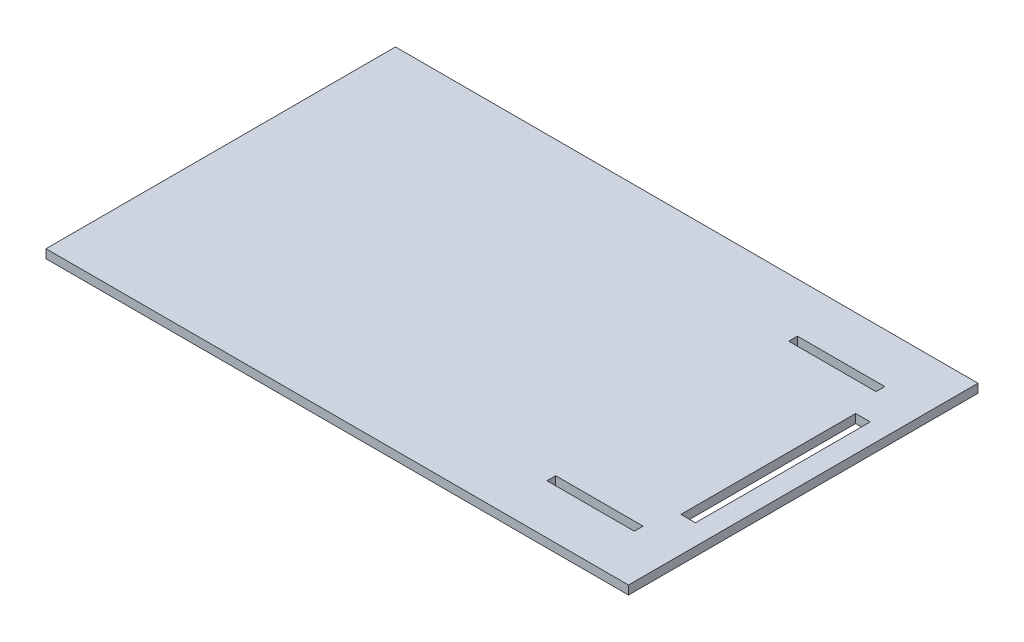
ISO-10303-21;
HEADER;
FILE_DESCRIPTION(('STEP AP214'),'2;1');
FILE_NAME('part.step','',(''),(''),'','','');
FILE_SCHEMA(('AUTOMOTIVE_DESIGN { 1 0 10303 214 1 1 1 1 }'));
ENDSEC;
DATA;
#1=APPLICATION_CONTEXT('core data for automotive mechanical design processes');
#2=APPLICATION_PROTOCOL_DEFINITION('international standard','automotive_design',2000,#1);
#3=PRODUCT_CONTEXT('',#1,'mechanical');
#4=PRODUCT('Part','Part','',(#3));
#5=PRODUCT_RELATED_PRODUCT_CATEGORY('part','',(#4));
#6=PRODUCT_DEFINITION_FORMATION('','',#4);
#7=PRODUCT_DEFINITION_CONTEXT('part definition',#1,'design');
#8=PRODUCT_DEFINITION('design','',#6,#7);
#9=PRODUCT_DEFINITION_SHAPE('','',#8);
#10=(LENGTH_UNIT() NAMED_UNIT(*) SI_UNIT(.MILLI.,.METRE.));
#11=(NAMED_UNIT(*) PLANE_ANGLE_UNIT() SI_UNIT($,.RADIAN.));
#12=(NAMED_UNIT(*) SI_UNIT($,.STERADIAN.) SOLID_ANGLE_UNIT());
#13=UNCERTAINTY_MEASURE_WITH_UNIT(LENGTH_MEASURE(1.E-05),#10,'distance_accuracy_value','');
#14=(GEOMETRIC_REPRESENTATION_CONTEXT(3) GLOBAL_UNCERTAINTY_ASSIGNED_CONTEXT((#13)) GLOBAL_UNIT_ASSIGNED_CONTEXT((#10,
#11,#12)) REPRESENTATION_CONTEXT('',''));
#15=CARTESIAN_POINT('',(0.,0.,0.));
#16=DIRECTION('',(0.,0.,1.));
#17=DIRECTION('',(1.,0.,0.));
#18=AXIS2_PLACEMENT_3D('',#15,#16,#17);
#19=CARTESIAN_POINT('',(-100.,3.,60.));
#20=DIRECTION('',(1.,0.,0.));
#21=DIRECTION('',(0.,0.,-1.));
#22=AXIS2_PLACEMENT_3D('',#19,#20,#21);
#23=PLANE('',#22);
#24=DIRECTION('',(0.,0.,1.));
#25=VECTOR('',#24,1.);
#26=CARTESIAN_POINT('',(-100.,0.,60.));
#27=LINE('',#26,#25);
#28=CARTESIAN_POINT('',(-100.,0.,-60.));
#29=VERTEX_POINT('',#28);
#30=CARTESIAN_POINT('',(-100.,0.,60.));
#31=VERTEX_POINT('',#30);
#32=EDGE_CURVE('E238',#29,#31,#27,.T.);
#33=ORIENTED_EDGE('',*,*,#32,.T.);
#34=DIRECTION('',(0.,-1.,0.));
#35=VECTOR('',#34,1.);
#36=CARTESIAN_POINT('',(-100.,3.,60.));
#37=LINE('',#36,#35);
#38=CARTESIAN_POINT('',(-100.,3.,60.));
#39=VERTEX_POINT('',#38);
#40=EDGE_CURVE('E11',#39,#31,#37,.T.);
#41=ORIENTED_EDGE('',*,*,#40,.F.);
#42=DIRECTION('',(0.,0.,1.));
#43=VECTOR('',#42,1.);
#44=CARTESIAN_POINT('',(-100.,3.,60.));
#45=LINE('',#44,#43);
#46=CARTESIAN_POINT('',(-100.,3.,-60.));
#47=VERTEX_POINT('',#46);
#48=EDGE_CURVE('E245',#47,#39,#45,.T.);
#49=ORIENTED_EDGE('',*,*,#48,.F.);
#50=DIRECTION('',(0.,-1.,0.));
#51=VECTOR('',#50,1.);
#52=CARTESIAN_POINT('',(-100.,3.,-60.));
#53=LINE('',#52,#51);
#54=EDGE_CURVE('E255',#47,#29,#53,.T.);
#55=ORIENTED_EDGE('',*,*,#54,.T.);
#56=EDGE_LOOP('',(#33,#41,#49,#55));
#57=FACE_BOUND('',#56,.T.);
#58=ADVANCED_FACE('F32',(#57),#23,.F.);
#59=CARTESIAN_POINT('',(100.,3.,60.));
#60=DIRECTION('',(0.,0.,-1.));
#61=DIRECTION('',(-1.,0.,0.));
#62=AXIS2_PLACEMENT_3D('',#59,#60,#61);
#63=PLANE('',#62);
#64=DIRECTION('',(1.,0.,0.));
#65=VECTOR('',#64,1.);
#66=CARTESIAN_POINT('',(100.,0.,60.));
#67=LINE('',#66,#65);
#68=CARTESIAN_POINT('',(100.,0.,60.));
#69=VERTEX_POINT('',#68);
#70=EDGE_CURVE('E258',#31,#69,#67,.T.);
#71=ORIENTED_EDGE('',*,*,#70,.T.);
#72=DIRECTION('',(0.,-1.,0.));
#73=VECTOR('',#72,1.);
#74=CARTESIAN_POINT('',(100.,3.,60.));
#75=LINE('',#74,#73);
#76=CARTESIAN_POINT('',(100.,3.,60.));
#77=VERTEX_POINT('',#76);
#78=EDGE_CURVE('E39',#77,#69,#75,.T.);
#79=ORIENTED_EDGE('',*,*,#78,.F.);
#80=DIRECTION('',(1.,0.,0.));
#81=VECTOR('',#80,1.);
#82=CARTESIAN_POINT('',(100.,3.,60.));
#83=LINE('',#82,#81);
#84=EDGE_CURVE('E248',#39,#77,#83,.T.);
#85=ORIENTED_EDGE('',*,*,#84,.F.);
#86=ORIENTED_EDGE('',*,*,#40,.T.);
#87=EDGE_LOOP('',(#71,#79,#85,#86));
#88=FACE_BOUND('',#87,.T.);
#89=ADVANCED_FACE('F287',(#88),#63,.F.);
#90=CARTESIAN_POINT('',(100.,3.,60.));
#91=DIRECTION('',(-1.,0.,0.));
#92=DIRECTION('',(0.,0.,1.));
#93=AXIS2_PLACEMENT_3D('',#90,#91,#92);
#94=PLANE('',#93);
#95=DIRECTION('',(0.,0.,-1.));
#96=VECTOR('',#95,1.);
#97=CARTESIAN_POINT('',(100.,0.,60.));
#98=LINE('',#97,#96);
#99=CARTESIAN_POINT('',(100.,0.,-60.));
#100=VERTEX_POINT('',#99);
#101=EDGE_CURVE('E260',#69,#100,#98,.T.);
#102=ORIENTED_EDGE('',*,*,#101,.T.);
#103=DIRECTION('',(0.,-1.,0.));
#104=VECTOR('',#103,1.);
#105=CARTESIAN_POINT('',(100.,3.,-60.));
#106=LINE('',#105,#104);
#107=CARTESIAN_POINT('',(100.,3.,-60.));
#108=VERTEX_POINT('',#107);
#109=EDGE_CURVE('E265',#108,#100,#106,.T.);
#110=ORIENTED_EDGE('',*,*,#109,.F.);
#111=DIRECTION('',(0.,0.,-1.));
#112=VECTOR('',#111,1.);
#113=CARTESIAN_POINT('',(100.,3.,60.));
#114=LINE('',#113,#112);
#115=EDGE_CURVE('E251',#77,#108,#114,.T.);
#116=ORIENTED_EDGE('',*,*,#115,.F.);
#117=ORIENTED_EDGE('',*,*,#78,.T.);
#118=EDGE_LOOP('',(#102,#110,#116,#117));
#119=FACE_BOUND('',#118,.T.);
#120=ADVANCED_FACE('F272',(#119),#94,.F.);
#121=CARTESIAN_POINT('',(100.,3.,-60.));
#122=DIRECTION('',(0.,0.,1.));
#123=DIRECTION('',(1.,0.,0.));
#124=AXIS2_PLACEMENT_3D('',#121,#122,#123);
#125=PLANE('',#124);
#126=DIRECTION('',(-1.,0.,0.));
#127=VECTOR('',#126,1.);
#128=CARTESIAN_POINT('',(100.,0.,-60.));
#129=LINE('',#128,#127);
#130=EDGE_CURVE('E249',#100,#29,#129,.T.);
#131=ORIENTED_EDGE('',*,*,#130,.T.);
#132=ORIENTED_EDGE('',*,*,#54,.F.);
#133=DIRECTION('',(-1.,0.,0.));
#134=VECTOR('',#133,1.);
#135=CARTESIAN_POINT('',(100.,3.,-60.));
#136=LINE('',#135,#134);
#137=EDGE_CURVE('E253',#108,#47,#136,.T.);
#138=ORIENTED_EDGE('',*,*,#137,.F.);
#139=ORIENTED_EDGE('',*,*,#109,.T.);
#140=EDGE_LOOP('',(#131,#132,#138,#139));
#141=FACE_BOUND('',#140,.T.);
#142=ADVANCED_FACE('F280',(#141),#125,.F.);
#143=CARTESIAN_POINT('',(0.,3.,0.));
#144=DIRECTION('',(0.,1.,0.));
#145=DIRECTION('',(0.,0.,1.));
#146=AXIS2_PLACEMENT_3D('',#143,#144,#145);
#147=PLANE('',#146);
#148=DIRECTION('',(1.,0.,0.));
#149=VECTOR('',#148,1.);
#150=CARTESIAN_POINT('',(55.,3.,43.));
#151=LINE('',#150,#149);
#152=CARTESIAN_POINT('',(55.,3.,43.));
#153=VERTEX_POINT('',#152);
#154=CARTESIAN_POINT('',(85.,3.,43.));
#155=VERTEX_POINT('',#154);
#156=EDGE_CURVE('E46',#153,#155,#151,.T.);
#157=ORIENTED_EDGE('',*,*,#156,.F.);
#158=DIRECTION('',(0.,0.,1.));
#159=VECTOR('',#158,1.);
#160=CARTESIAN_POINT('',(55.,3.,43.));
#161=LINE('',#160,#159);
#162=CARTESIAN_POINT('',(55.,3.,40.));
#163=VERTEX_POINT('',#162);
#164=EDGE_CURVE('E162',#163,#153,#161,.T.);
#165=ORIENTED_EDGE('',*,*,#164,.F.);
#166=DIRECTION('',(-1.,0.,0.));
#167=VECTOR('',#166,1.);
#168=CARTESIAN_POINT('',(55.,3.,40.));
#169=LINE('',#168,#167);
#170=CARTESIAN_POINT('',(85.,3.,40.));
#171=VERTEX_POINT('',#170);
#172=EDGE_CURVE('E165',#171,#163,#169,.T.);
#173=ORIENTED_EDGE('',*,*,#172,.F.);
#174=DIRECTION('',(0.,0.,-1.));
#175=VECTOR('',#174,1.);
#176=CARTESIAN_POINT('',(85.,3.,43.));
#177=LINE('',#176,#175);
#178=EDGE_CURVE('E171',#155,#171,#177,.T.);
#179=ORIENTED_EDGE('',*,*,#178,.F.);
#180=EDGE_LOOP('',(#157,#165,#173,#179));
#181=FACE_BOUND('',#180,.T.);
#182=DIRECTION('',(0.,0.,-1.));
#183=VECTOR('',#182,1.);
#184=CARTESIAN_POINT('',(85.,3.,-43.));
#185=LINE('',#184,#183);
#186=CARTESIAN_POINT('',(85.,3.,-40.));
#187=VERTEX_POINT('',#186);
#188=CARTESIAN_POINT('',(85.,3.,-43.));
#189=VERTEX_POINT('',#188);
#190=EDGE_CURVE('E177',#187,#189,#185,.T.);
#191=ORIENTED_EDGE('',*,*,#190,.F.);
#192=DIRECTION('',(1.,0.,0.));
#193=VECTOR('',#192,1.);
#194=CARTESIAN_POINT('',(55.,3.,-40.));
#195=LINE('',#194,#193);
#196=CARTESIAN_POINT('',(55.,3.,-40.));
#197=VERTEX_POINT('',#196);
#198=EDGE_CURVE('E185',#197,#187,#195,.T.);
#199=ORIENTED_EDGE('',*,*,#198,.F.);
#200=DIRECTION('',(0.,0.,1.));
#201=VECTOR('',#200,1.);
#202=CARTESIAN_POINT('',(55.,3.,-43.));
#203=LINE('',#202,#201);
#204=CARTESIAN_POINT('',(55.,3.,-43.));
#205=VERTEX_POINT('',#204);
#206=EDGE_CURVE('E199',#205,#197,#203,.T.);
#207=ORIENTED_EDGE('',*,*,#206,.F.);
#208=DIRECTION('',(-1.,0.,0.));
#209=VECTOR('',#208,1.);
#210=CARTESIAN_POINT('',(55.,3.,-43.));
#211=LINE('',#210,#209);
#212=EDGE_CURVE('E196',#189,#205,#211,.T.);
#213=ORIENTED_EDGE('',*,*,#212,.F.);
#214=EDGE_LOOP('',(#191,#199,#207,#213));
#215=FACE_BOUND('',#214,.T.);
#216=DIRECTION('',(0.,0.,-1.));
#217=VECTOR('',#216,1.);
#218=CARTESIAN_POINT('',(93.,3.,-30.));
#219=LINE('',#218,#217);
#220=CARTESIAN_POINT('',(93.,3.,30.));
#221=VERTEX_POINT('',#220);
#222=CARTESIAN_POINT('',(93.,3.,-30.));
#223=VERTEX_POINT('',#222);
#224=EDGE_CURVE('E206',#221,#223,#219,.T.);
#225=ORIENTED_EDGE('',*,*,#224,.F.);
#226=DIRECTION('',(1.,0.,0.));
#227=VECTOR('',#226,1.);
#228=CARTESIAN_POINT('',(88.,3.,30.));
#229=LINE('',#228,#227);
#230=CARTESIAN_POINT('',(88.,3.,30.));
#231=VERTEX_POINT('',#230);
#232=EDGE_CURVE('E217',#231,#221,#229,.T.);
#233=ORIENTED_EDGE('',*,*,#232,.F.);
#234=DIRECTION('',(0.,0.,1.));
#235=VECTOR('',#234,1.);
#236=CARTESIAN_POINT('',(88.,3.,-30.));
#237=LINE('',#236,#235);
#238=CARTESIAN_POINT('',(88.,3.,-30.));
#239=VERTEX_POINT('',#238);
#240=EDGE_CURVE('E231',#239,#231,#237,.T.);
#241=ORIENTED_EDGE('',*,*,#240,.F.);
#242=DIRECTION('',(-1.,0.,0.));
#243=VECTOR('',#242,1.);
#244=CARTESIAN_POINT('',(88.,3.,-30.));
#245=LINE('',#244,#243);
#246=EDGE_CURVE('E228',#223,#239,#245,.T.);
#247=ORIENTED_EDGE('',*,*,#246,.F.);
#248=EDGE_LOOP('',(#225,#233,#241,#247));
#249=FACE_BOUND('',#248,.T.);
#250=ORIENTED_EDGE('',*,*,#48,.T.);
#251=ORIENTED_EDGE('',*,*,#84,.T.);
#252=ORIENTED_EDGE('',*,*,#115,.T.);
#253=ORIENTED_EDGE('',*,*,#137,.T.);
#254=EDGE_LOOP('',(#250,#251,#252,#253));
#255=FACE_BOUND('',#254,.T.);
#256=ADVANCED_FACE('F286',(#181,#215,#249,#255),#147,.T.);
#257=CARTESIAN_POINT('',(0.,0.,0.));
#258=DIRECTION('',(0.,1.,0.));
#259=DIRECTION('',(0.,0.,1.));
#260=AXIS2_PLACEMENT_3D('',#257,#258,#259);
#261=PLANE('',#260);
#262=DIRECTION('',(0.,0.,1.));
#263=VECTOR('',#262,1.);
#264=CARTESIAN_POINT('',(55.,0.,43.));
#265=LINE('',#264,#263);
#266=CARTESIAN_POINT('',(55.,0.,40.));
#267=VERTEX_POINT('',#266);
#268=CARTESIAN_POINT('',(55.,0.,43.));
#269=VERTEX_POINT('',#268);
#270=EDGE_CURVE('E152',#267,#269,#265,.T.);
#271=ORIENTED_EDGE('',*,*,#270,.T.);
#272=DIRECTION('',(1.,0.,0.));
#273=VECTOR('',#272,1.);
#274=CARTESIAN_POINT('',(55.,0.,43.));
#275=LINE('',#274,#273);
#276=CARTESIAN_POINT('',(85.,0.,43.));
#277=VERTEX_POINT('',#276);
#278=EDGE_CURVE('E146',#269,#277,#275,.T.);
#279=ORIENTED_EDGE('',*,*,#278,.T.);
#280=DIRECTION('',(0.,0.,-1.));
#281=VECTOR('',#280,1.);
#282=CARTESIAN_POINT('',(85.,0.,43.));
#283=LINE('',#282,#281);
#284=CARTESIAN_POINT('',(85.,0.,40.));
#285=VERTEX_POINT('',#284);
#286=EDGE_CURVE('E155',#277,#285,#283,.T.);
#287=ORIENTED_EDGE('',*,*,#286,.T.);
#288=DIRECTION('',(-1.,0.,0.));
#289=VECTOR('',#288,1.);
#290=CARTESIAN_POINT('',(55.,0.,40.));
#291=LINE('',#290,#289);
#292=EDGE_CURVE('E54',#285,#267,#291,.T.);
#293=ORIENTED_EDGE('',*,*,#292,.T.);
#294=EDGE_LOOP('',(#271,#279,#287,#293));
#295=FACE_BOUND('',#294,.T.);
#296=DIRECTION('',(1.,0.,0.));
#297=VECTOR('',#296,1.);
#298=CARTESIAN_POINT('',(55.,0.,-40.));
#299=LINE('',#298,#297);
#300=CARTESIAN_POINT('',(55.,0.,-40.));
#301=VERTEX_POINT('',#300);
#302=CARTESIAN_POINT('',(85.,0.,-40.));
#303=VERTEX_POINT('',#302);
#304=EDGE_CURVE('E191',#301,#303,#299,.T.);
#305=ORIENTED_EDGE('',*,*,#304,.T.);
#306=DIRECTION('',(0.,0.,-1.));
#307=VECTOR('',#306,1.);
#308=CARTESIAN_POINT('',(85.,0.,-43.));
#309=LINE('',#308,#307);
#310=CARTESIAN_POINT('',(85.,0.,-43.));
#311=VERTEX_POINT('',#310);
#312=EDGE_CURVE('E181',#303,#311,#309,.T.);
#313=ORIENTED_EDGE('',*,*,#312,.T.);
#314=DIRECTION('',(-1.,0.,0.));
#315=VECTOR('',#314,1.);
#316=CARTESIAN_POINT('',(55.,0.,-43.));
#317=LINE('',#316,#315);
#318=CARTESIAN_POINT('',(55.,0.,-43.));
#319=VERTEX_POINT('',#318);
#320=EDGE_CURVE('E184',#311,#319,#317,.T.);
#321=ORIENTED_EDGE('',*,*,#320,.T.);
#322=DIRECTION('',(0.,0.,1.));
#323=VECTOR('',#322,1.);
#324=CARTESIAN_POINT('',(55.,0.,-43.));
#325=LINE('',#324,#323);
#326=EDGE_CURVE('E188',#319,#301,#325,.T.);
#327=ORIENTED_EDGE('',*,*,#326,.T.);
#328=EDGE_LOOP('',(#305,#313,#321,#327));
#329=FACE_BOUND('',#328,.T.);
#330=DIRECTION('',(1.,0.,0.));
#331=VECTOR('',#330,1.);
#332=CARTESIAN_POINT('',(88.,0.,30.));
#333=LINE('',#332,#331);
#334=CARTESIAN_POINT('',(88.,0.,30.));
#335=VERTEX_POINT('',#334);
#336=CARTESIAN_POINT('',(93.,0.,30.));
#337=VERTEX_POINT('',#336);
#338=EDGE_CURVE('E223',#335,#337,#333,.T.);
#339=ORIENTED_EDGE('',*,*,#338,.T.);
#340=DIRECTION('',(0.,0.,-1.));
#341=VECTOR('',#340,1.);
#342=CARTESIAN_POINT('',(93.,0.,-30.));
#343=LINE('',#342,#341);
#344=CARTESIAN_POINT('',(93.,0.,-30.));
#345=VERTEX_POINT('',#344);
#346=EDGE_CURVE('E213',#337,#345,#343,.T.);
#347=ORIENTED_EDGE('',*,*,#346,.T.);
#348=DIRECTION('',(-1.,0.,0.));
#349=VECTOR('',#348,1.);
#350=CARTESIAN_POINT('',(88.,0.,-30.));
#351=LINE('',#350,#349);
#352=CARTESIAN_POINT('',(88.,0.,-30.));
#353=VERTEX_POINT('',#352);
#354=EDGE_CURVE('E216',#345,#353,#351,.T.);
#355=ORIENTED_EDGE('',*,*,#354,.T.);
#356=DIRECTION('',(0.,0.,1.));
#357=VECTOR('',#356,1.);
#358=CARTESIAN_POINT('',(88.,0.,-30.));
#359=LINE('',#358,#357);
#360=EDGE_CURVE('E220',#353,#335,#359,.T.);
#361=ORIENTED_EDGE('',*,*,#360,.T.);
#362=EDGE_LOOP('',(#339,#347,#355,#361));
#363=FACE_BOUND('',#362,.T.);
#364=ORIENTED_EDGE('',*,*,#32,.F.);
#365=ORIENTED_EDGE('',*,*,#130,.F.);
#366=ORIENTED_EDGE('',*,*,#101,.F.);
#367=ORIENTED_EDGE('',*,*,#70,.F.);
#368=EDGE_LOOP('',(#364,#365,#366,#367));
#369=FACE_BOUND('',#368,.T.);
#370=ADVANCED_FACE('F159',(#295,#329,#363,#369),#261,.F.);
#371=CARTESIAN_POINT('',(93.,0.,-30.));
#372=DIRECTION('',(1.,0.,0.));
#373=DIRECTION('',(0.,0.,-1.));
#374=AXIS2_PLACEMENT_3D('',#371,#372,#373);
#375=PLANE('',#374);
#376=ORIENTED_EDGE('',*,*,#224,.T.);
#377=DIRECTION('',(0.,1.,0.));
#378=VECTOR('',#377,1.);
#379=CARTESIAN_POINT('',(93.,0.,-30.));
#380=LINE('',#379,#378);
#381=EDGE_CURVE('E226',#345,#223,#380,.T.);
#382=ORIENTED_EDGE('',*,*,#381,.F.);
#383=ORIENTED_EDGE('',*,*,#346,.F.);
#384=DIRECTION('',(0.,1.,0.));
#385=VECTOR('',#384,1.);
#386=CARTESIAN_POINT('',(93.,0.,30.));
#387=LINE('',#386,#385);
#388=EDGE_CURVE('E236',#337,#221,#387,.T.);
#389=ORIENTED_EDGE('',*,*,#388,.T.);
#390=EDGE_LOOP('',(#376,#382,#383,#389));
#391=FACE_BOUND('',#390,.T.);
#392=ADVANCED_FACE('F299',(#391),#375,.F.);
#393=CARTESIAN_POINT('',(88.,0.,30.));
#394=DIRECTION('',(0.,0.,1.));
#395=DIRECTION('',(1.,0.,0.));
#396=AXIS2_PLACEMENT_3D('',#393,#394,#395);
#397=PLANE('',#396);
#398=ORIENTED_EDGE('',*,*,#232,.T.);
#399=ORIENTED_EDGE('',*,*,#388,.F.);
#400=ORIENTED_EDGE('',*,*,#338,.F.);
#401=DIRECTION('',(0.,1.,0.));
#402=VECTOR('',#401,1.);
#403=CARTESIAN_POINT('',(88.,0.,30.));
#404=LINE('',#403,#402);
#405=EDGE_CURVE('E239',#335,#231,#404,.T.);
#406=ORIENTED_EDGE('',*,*,#405,.T.);
#407=EDGE_LOOP('',(#398,#399,#400,#406));
#408=FACE_BOUND('',#407,.T.);
#409=ADVANCED_FACE('F305',(#408),#397,.F.);
#410=CARTESIAN_POINT('',(88.,0.,-30.));
#411=DIRECTION('',(-1.,0.,0.));
#412=DIRECTION('',(0.,0.,1.));
#413=AXIS2_PLACEMENT_3D('',#410,#411,#412);
#414=PLANE('',#413);
#415=ORIENTED_EDGE('',*,*,#240,.T.);
#416=ORIENTED_EDGE('',*,*,#405,.F.);
#417=ORIENTED_EDGE('',*,*,#360,.F.);
#418=DIRECTION('',(0.,1.,0.));
#419=VECTOR('',#418,1.);
#420=CARTESIAN_POINT('',(88.,0.,-30.));
#421=LINE('',#420,#419);
#422=EDGE_CURVE('E241',#353,#239,#421,.T.);
#423=ORIENTED_EDGE('',*,*,#422,.T.);
#424=EDGE_LOOP('',(#415,#416,#417,#423));
#425=FACE_BOUND('',#424,.T.);
#426=ADVANCED_FACE('F311',(#425),#414,.F.);
#427=CARTESIAN_POINT('',(88.,0.,-30.));
#428=DIRECTION('',(0.,0.,-1.));
#429=DIRECTION('',(-1.,0.,0.));
#430=AXIS2_PLACEMENT_3D('',#427,#428,#429);
#431=PLANE('',#430);
#432=ORIENTED_EDGE('',*,*,#246,.T.);
#433=ORIENTED_EDGE('',*,*,#422,.F.);
#434=ORIENTED_EDGE('',*,*,#354,.F.);
#435=ORIENTED_EDGE('',*,*,#381,.T.);
#436=EDGE_LOOP('',(#432,#433,#434,#435));
#437=FACE_BOUND('',#436,.T.);
#438=ADVANCED_FACE('F307',(#437),#431,.F.);
#439=CARTESIAN_POINT('',(85.,0.,-43.));
#440=DIRECTION('',(1.,0.,0.));
#441=DIRECTION('',(0.,0.,-1.));
#442=AXIS2_PLACEMENT_3D('',#439,#440,#441);
#443=PLANE('',#442);
#444=ORIENTED_EDGE('',*,*,#190,.T.);
#445=DIRECTION('',(0.,1.,0.));
#446=VECTOR('',#445,1.);
#447=CARTESIAN_POINT('',(85.,0.,-43.));
#448=LINE('',#447,#446);
#449=EDGE_CURVE('E194',#311,#189,#448,.T.);
#450=ORIENTED_EDGE('',*,*,#449,.F.);
#451=ORIENTED_EDGE('',*,*,#312,.F.);
#452=DIRECTION('',(0.,1.,0.));
#453=VECTOR('',#452,1.);
#454=CARTESIAN_POINT('',(85.,0.,-40.));
#455=LINE('',#454,#453);
#456=EDGE_CURVE('E204',#303,#187,#455,.T.);
#457=ORIENTED_EDGE('',*,*,#456,.T.);
#458=EDGE_LOOP('',(#444,#450,#451,#457));
#459=FACE_BOUND('',#458,.T.);
#460=ADVANCED_FACE('F310',(#459),#443,.F.);
#461=CARTESIAN_POINT('',(55.,0.,-40.));
#462=DIRECTION('',(0.,0.,1.));
#463=DIRECTION('',(1.,0.,0.));
#464=AXIS2_PLACEMENT_3D('',#461,#462,#463);
#465=PLANE('',#464);
#466=ORIENTED_EDGE('',*,*,#198,.T.);
#467=ORIENTED_EDGE('',*,*,#456,.F.);
#468=ORIENTED_EDGE('',*,*,#304,.F.);
#469=DIRECTION('',(0.,1.,0.));
#470=VECTOR('',#469,1.);
#471=CARTESIAN_POINT('',(55.,0.,-40.));
#472=LINE('',#471,#470);
#473=EDGE_CURVE('E207',#301,#197,#472,.T.);
#474=ORIENTED_EDGE('',*,*,#473,.T.);
#475=EDGE_LOOP('',(#466,#467,#468,#474));
#476=FACE_BOUND('',#475,.T.);
#477=ADVANCED_FACE('F321',(#476),#465,.F.);
#478=CARTESIAN_POINT('',(55.,0.,-43.));
#479=DIRECTION('',(-1.,0.,0.));
#480=DIRECTION('',(0.,0.,1.));
#481=AXIS2_PLACEMENT_3D('',#478,#479,#480);
#482=PLANE('',#481);
#483=ORIENTED_EDGE('',*,*,#206,.T.);
#484=ORIENTED_EDGE('',*,*,#473,.F.);
#485=ORIENTED_EDGE('',*,*,#326,.F.);
#486=DIRECTION('',(0.,1.,0.));
#487=VECTOR('',#486,1.);
#488=CARTESIAN_POINT('',(55.,0.,-43.));
#489=LINE('',#488,#487);
#490=EDGE_CURVE('E209',#319,#205,#489,.T.);
#491=ORIENTED_EDGE('',*,*,#490,.T.);
#492=EDGE_LOOP('',(#483,#484,#485,#491));
#493=FACE_BOUND('',#492,.T.);
#494=ADVANCED_FACE('F326',(#493),#482,.F.);
#495=CARTESIAN_POINT('',(55.,0.,-43.));
#496=DIRECTION('',(0.,0.,-1.));
#497=DIRECTION('',(-1.,0.,0.));
#498=AXIS2_PLACEMENT_3D('',#495,#496,#497);
#499=PLANE('',#498);
#500=ORIENTED_EDGE('',*,*,#212,.T.);
#501=ORIENTED_EDGE('',*,*,#490,.F.);
#502=ORIENTED_EDGE('',*,*,#320,.F.);
#503=ORIENTED_EDGE('',*,*,#449,.T.);
#504=EDGE_LOOP('',(#500,#501,#502,#503));
#505=FACE_BOUND('',#504,.T.);
#506=ADVANCED_FACE('F323',(#505),#499,.F.);
#507=CARTESIAN_POINT('',(55.,0.,43.));
#508=DIRECTION('',(0.,0.,1.));
#509=DIRECTION('',(1.,0.,0.));
#510=AXIS2_PLACEMENT_3D('',#507,#508,#509);
#511=PLANE('',#510);
#512=ORIENTED_EDGE('',*,*,#156,.T.);
#513=DIRECTION('',(0.,1.,0.));
#514=VECTOR('',#513,1.);
#515=CARTESIAN_POINT('',(85.,0.,43.));
#516=LINE('',#515,#514);
#517=EDGE_CURVE('E142',#277,#155,#516,.T.);
#518=ORIENTED_EDGE('',*,*,#517,.F.);
#519=ORIENTED_EDGE('',*,*,#278,.F.);
#520=DIRECTION('',(0.,1.,0.));
#521=VECTOR('',#520,1.);
#522=CARTESIAN_POINT('',(55.,0.,43.));
#523=LINE('',#522,#521);
#524=EDGE_CURVE('E175',#269,#153,#523,.T.);
#525=ORIENTED_EDGE('',*,*,#524,.T.);
#526=EDGE_LOOP('',(#512,#518,#519,#525));
#527=FACE_BOUND('',#526,.T.);
#528=ADVANCED_FACE('F144',(#527),#511,.F.);
#529=CARTESIAN_POINT('',(55.,0.,43.));
#530=DIRECTION('',(-1.,0.,0.));
#531=DIRECTION('',(0.,0.,1.));
#532=AXIS2_PLACEMENT_3D('',#529,#530,#531);
#533=PLANE('',#532);
#534=ORIENTED_EDGE('',*,*,#164,.T.);
#535=ORIENTED_EDGE('',*,*,#524,.F.);
#536=ORIENTED_EDGE('',*,*,#270,.F.);
#537=DIRECTION('',(0.,1.,0.));
#538=VECTOR('',#537,1.);
#539=CARTESIAN_POINT('',(55.,0.,40.));
#540=LINE('',#539,#538);
#541=EDGE_CURVE('E178',#267,#163,#540,.T.);
#542=ORIENTED_EDGE('',*,*,#541,.T.);
#543=EDGE_LOOP('',(#534,#535,#536,#542));
#544=FACE_BOUND('',#543,.T.);
#545=ADVANCED_FACE('F336',(#544),#533,.F.);
#546=CARTESIAN_POINT('',(55.,0.,40.));
#547=DIRECTION('',(0.,0.,-1.));
#548=DIRECTION('',(-1.,0.,0.));
#549=AXIS2_PLACEMENT_3D('',#546,#547,#548);
#550=PLANE('',#549);
#551=ORIENTED_EDGE('',*,*,#172,.T.);
#552=ORIENTED_EDGE('',*,*,#541,.F.);
#553=ORIENTED_EDGE('',*,*,#292,.F.);
#554=DIRECTION('',(0.,1.,0.));
#555=VECTOR('',#554,1.);
#556=CARTESIAN_POINT('',(85.,0.,40.));
#557=LINE('',#556,#555);
#558=EDGE_CURVE('E151',#285,#171,#557,.T.);
#559=ORIENTED_EDGE('',*,*,#558,.T.);
#560=EDGE_LOOP('',(#551,#552,#553,#559));
#561=FACE_BOUND('',#560,.T.);
#562=ADVANCED_FACE('F339',(#561),#550,.F.);
#563=CARTESIAN_POINT('',(85.,0.,43.));
#564=DIRECTION('',(1.,0.,0.));
#565=DIRECTION('',(0.,0.,-1.));
#566=AXIS2_PLACEMENT_3D('',#563,#564,#565);
#567=PLANE('',#566);
#568=ORIENTED_EDGE('',*,*,#178,.T.);
#569=ORIENTED_EDGE('',*,*,#558,.F.);
#570=ORIENTED_EDGE('',*,*,#286,.F.);
#571=ORIENTED_EDGE('',*,*,#517,.T.);
#572=EDGE_LOOP('',(#568,#569,#570,#571));
#573=FACE_BOUND('',#572,.T.);
#574=ADVANCED_FACE('F156',(#573),#567,.F.);
#575=CLOSED_SHELL('',(#58,#89,#120,#142,#256,#370,#392,#409,#426,#438,#460,#477,#494,#506,#528,
#545,#562,#574));
#576=MANIFOLD_SOLID_BREP('B2',#575);
#577=ADVANCED_BREP_SHAPE_REPRESENTATION('',(#18,#576),#14);
#578=SHAPE_DEFINITION_REPRESENTATION(#9,#577);
ENDSEC;
END-ISO-10303-21;
